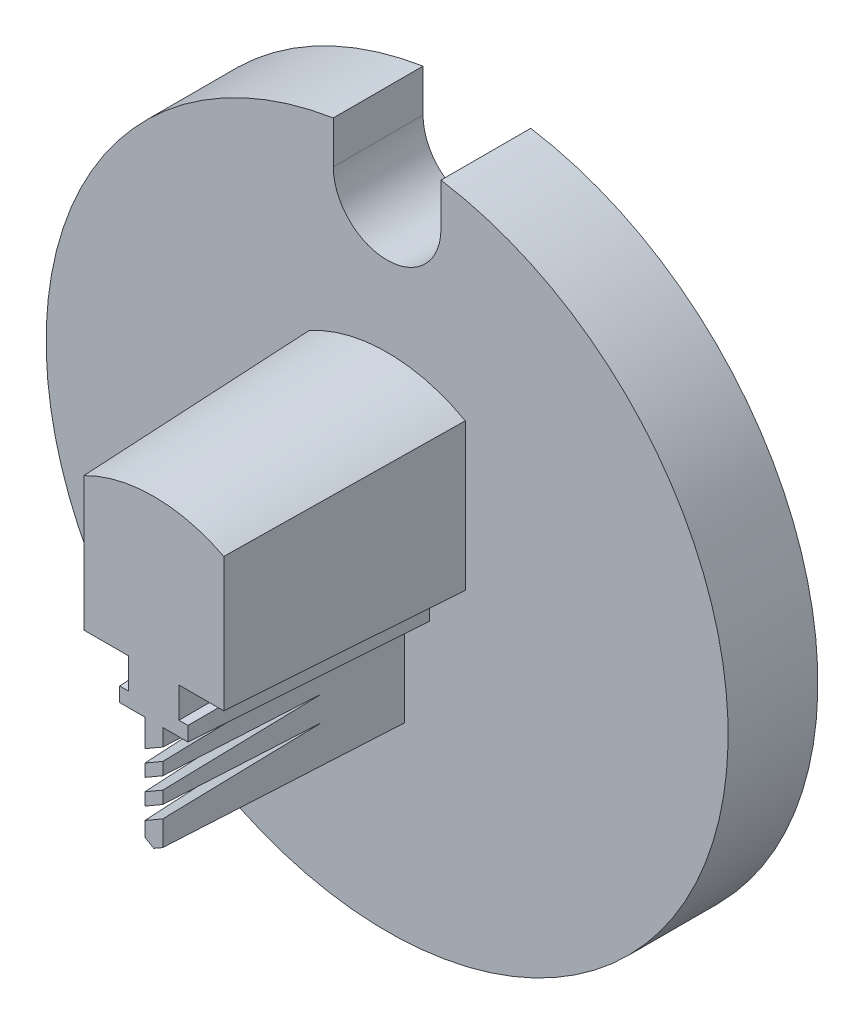
ISO-10303-21;
HEADER;
FILE_DESCRIPTION(('STEP AP214'),'2;1');
FILE_NAME('part.step','',(''),(''),'','','');
FILE_SCHEMA(('AUTOMOTIVE_DESIGN { 1 0 10303 214 1 1 1 1 }'));
ENDSEC;
DATA;
#1=APPLICATION_CONTEXT('core data for automotive mechanical design processes');
#2=APPLICATION_PROTOCOL_DEFINITION('international standard','automotive_design',2000,#1);
#3=PRODUCT_CONTEXT('',#1,'mechanical');
#4=PRODUCT('Part','Part','',(#3));
#5=PRODUCT_RELATED_PRODUCT_CATEGORY('part','',(#4));
#6=PRODUCT_DEFINITION_FORMATION('','',#4);
#7=PRODUCT_DEFINITION_CONTEXT('part definition',#1,'design');
#8=PRODUCT_DEFINITION('design','',#6,#7);
#9=PRODUCT_DEFINITION_SHAPE('','',#8);
#10=(LENGTH_UNIT() NAMED_UNIT(*) SI_UNIT(.MILLI.,.METRE.));
#11=(NAMED_UNIT(*) PLANE_ANGLE_UNIT() SI_UNIT($,.RADIAN.));
#12=(NAMED_UNIT(*) SI_UNIT($,.STERADIAN.) SOLID_ANGLE_UNIT());
#13=UNCERTAINTY_MEASURE_WITH_UNIT(LENGTH_MEASURE(1.E-05),#10,'distance_accuracy_value','');
#14=(GEOMETRIC_REPRESENTATION_CONTEXT(3) GLOBAL_UNCERTAINTY_ASSIGNED_CONTEXT((#13)) GLOBAL_UNIT_ASSIGNED_CONTEXT((#10,
#11,#12)) REPRESENTATION_CONTEXT('',''));
#15=CARTESIAN_POINT('',(0.,0.,0.));
#16=DIRECTION('',(0.,0.,1.));
#17=DIRECTION('',(1.,0.,0.));
#18=AXIS2_PLACEMENT_3D('',#15,#16,#17);
#19=CARTESIAN_POINT('',(0.,-0.800000052899123,9.));
#20=DIRECTION('',(0.,0.999390827019096,0.0348994967025009));
#21=DIRECTION('',(0.,-0.0348994967025009,0.999390827019096));
#22=AXIS2_PLACEMENT_3D('',#19,#20,#21);
#23=PLANE('',#22);
#24=DIRECTION('',(0.0348782627423745,-0.0348782627423746,0.998782765958718));
#25=VECTOR('',#24,1.);
#26=CARTESIAN_POINT('',(-0.926984948797238,-0.573015051202763,2.5));
#27=LINE('',#26,#25);
#28=CARTESIAN_POINT('',(-0.926984948797238,-0.573015051202763,2.5));
#29=VERTEX_POINT('',#28);
#30=CARTESIAN_POINT('',(-0.699999947100878,-0.800000052899123,9.));
#31=VERTEX_POINT('',#30);
#32=EDGE_CURVE('E132',#29,#31,#27,.T.);
#33=ORIENTED_EDGE('',*,*,#32,.F.);
#34=DIRECTION('',(1.,0.,0.));
#35=VECTOR('',#34,1.);
#36=CARTESIAN_POINT('',(0.,-0.573015051202763,2.5));
#37=LINE('',#36,#35);
#38=CARTESIAN_POINT('',(-1.17698494879724,-0.573015051202763,2.5));
#39=VERTEX_POINT('',#38);
#40=EDGE_CURVE('E138',#29,#39,#37,.F.);
#41=ORIENTED_EDGE('',*,*,#40,.T.);
#42=DIRECTION('',(-0.0348782627423745,0.0348782627423746,-0.998782765958718));
#43=VECTOR('',#42,1.);
#44=CARTESIAN_POINT('',(-0.949999947100878,-0.800000052899123,9.));
#45=LINE('',#44,#43);
#46=CARTESIAN_POINT('',(-0.949999947100878,-0.800000052899123,9.));
#47=VERTEX_POINT('',#46);
#48=EDGE_CURVE('E134',#47,#39,#45,.T.);
#49=ORIENTED_EDGE('',*,*,#48,.F.);
#50=DIRECTION('',(1.,0.,0.));
#51=VECTOR('',#50,1.);
#52=CARTESIAN_POINT('',(0.,-0.800000052899123,9.));
#53=LINE('',#52,#51);
#54=EDGE_CURVE('E130',#47,#31,#53,.T.);
#55=ORIENTED_EDGE('',*,*,#54,.T.);
#56=EDGE_LOOP('',(#33,#41,#49,#55));
#57=FACE_BOUND('',#56,.T.);
#58=ADVANCED_FACE('F17',(#57),#23,.T.);
#59=CARTESIAN_POINT('',(0.,-0.800000052899123,9.));
#60=DIRECTION('',(0.,0.999390827019096,0.0348994967025009));
#61=DIRECTION('',(0.,-0.0348994967025009,0.999390827019096));
#62=AXIS2_PLACEMENT_3D('',#59,#60,#61);
#63=PLANE('',#62);
#64=DIRECTION('',(1.,0.,0.));
#65=VECTOR('',#64,1.);
#66=CARTESIAN_POINT('',(0.,-0.573015051202763,2.5));
#67=LINE('',#66,#65);
#68=CARTESIAN_POINT('',(1.17698494879724,-0.573015051202763,2.5));
#69=VERTEX_POINT('',#68);
#70=CARTESIAN_POINT('',(0.926984948797238,-0.573015051202763,2.5));
#71=VERTEX_POINT('',#70);
#72=EDGE_CURVE('E168',#69,#71,#67,.F.);
#73=ORIENTED_EDGE('',*,*,#72,.T.);
#74=DIRECTION('',(0.0348782627423745,0.0348782627423746,-0.998782765958718));
#75=VECTOR('',#74,1.);
#76=CARTESIAN_POINT('',(0.699999947100878,-0.800000052899123,9.));
#77=LINE('',#76,#75);
#78=CARTESIAN_POINT('',(0.699999947100878,-0.800000052899123,9.));
#79=VERTEX_POINT('',#78);
#80=EDGE_CURVE('E148',#79,#71,#77,.T.);
#81=ORIENTED_EDGE('',*,*,#80,.F.);
#82=DIRECTION('',(1.,0.,0.));
#83=VECTOR('',#82,1.);
#84=CARTESIAN_POINT('',(0.,-0.800000052899123,9.));
#85=LINE('',#84,#83);
#86=CARTESIAN_POINT('',(0.949999947100878,-0.800000052899123,9.));
#87=VERTEX_POINT('',#86);
#88=EDGE_CURVE('E166',#79,#87,#85,.T.);
#89=ORIENTED_EDGE('',*,*,#88,.T.);
#90=DIRECTION('',(-0.0348782627423745,-0.0348782627423746,0.998782765958718));
#91=VECTOR('',#90,1.);
#92=CARTESIAN_POINT('',(1.17698494879724,-0.573015051202763,2.5));
#93=LINE('',#92,#91);
#94=EDGE_CURVE('E184',#69,#87,#93,.T.);
#95=ORIENTED_EDGE('',*,*,#94,.F.);
#96=EDGE_LOOP('',(#73,#81,#89,#95));
#97=FACE_BOUND('',#96,.T.);
#98=ADVANCED_FACE('F330',(#97),#63,.T.);
#99=CARTESIAN_POINT('',(-0.949999947100878,-0.059584240176571,9.));
#100=DIRECTION('',(-0.999390827019096,0.,0.0348994967025009));
#101=DIRECTION('',(0.0348994967025009,0.,0.999390827019096));
#102=AXIS2_PLACEMENT_3D('',#99,#100,#101);
#103=PLANE('',#102);
#104=ORIENTED_EDGE('',*,*,#48,.T.);
#105=DIRECTION('',(0.,1.,0.));
#106=VECTOR('',#105,1.);
#107=CARTESIAN_POINT('',(-1.17698494879724,-0.059584240176571,2.5));
#108=LINE('',#107,#106);
#109=CARTESIAN_POINT('',(-1.17698494879724,-1.42698494879724,2.5));
#110=VERTEX_POINT('',#109);
#111=EDGE_CURVE('E153',#39,#110,#108,.F.);
#112=ORIENTED_EDGE('',*,*,#111,.T.);
#113=DIRECTION('',(-0.0348782627423749,-0.0348782627423745,-0.998782765958718));
#114=VECTOR('',#113,1.);
#115=CARTESIAN_POINT('',(-0.949999947100878,-1.19999994710088,9.));
#116=LINE('',#115,#114);
#117=CARTESIAN_POINT('',(-0.949999947100878,-1.19999994710088,9.));
#118=VERTEX_POINT('',#117);
#119=EDGE_CURVE('E190',#118,#110,#116,.T.);
#120=ORIENTED_EDGE('',*,*,#119,.F.);
#121=DIRECTION('',(0.,1.,0.));
#122=VECTOR('',#121,1.);
#123=CARTESIAN_POINT('',(-0.949999947100878,-0.059584240176571,9.));
#124=LINE('',#123,#122);
#125=EDGE_CURVE('E172',#118,#47,#124,.T.);
#126=ORIENTED_EDGE('',*,*,#125,.T.);
#127=EDGE_LOOP('',(#104,#112,#120,#126));
#128=FACE_BOUND('',#127,.T.);
#129=ADVANCED_FACE('F328',(#128),#103,.T.);
#130=CARTESIAN_POINT('',(-0.699999947100878,-0.059584240176571,9.));
#131=DIRECTION('',(-0.999390827019096,0.,0.0348994967025009));
#132=DIRECTION('',(0.0348994967025009,0.,0.999390827019096));
#133=AXIS2_PLACEMENT_3D('',#130,#131,#132);
#134=PLANE('',#133);
#135=DIRECTION('',(0.,1.,0.));
#136=VECTOR('',#135,1.);
#137=CARTESIAN_POINT('',(-0.926984948797238,-0.059584240176571,2.5));
#138=LINE('',#137,#136);
#139=CARTESIAN_POINT('',(-0.926984948797238,-0.176984948797237,2.5));
#140=VERTEX_POINT('',#139);
#141=EDGE_CURVE('E146',#140,#29,#138,.F.);
#142=ORIENTED_EDGE('',*,*,#141,.T.);
#143=ORIENTED_EDGE('',*,*,#32,.T.);
#144=DIRECTION('',(0.,1.,0.));
#145=VECTOR('',#144,1.);
#146=CARTESIAN_POINT('',(-0.699999947100878,-0.059584240176571,9.));
#147=LINE('',#146,#145);
#148=CARTESIAN_POINT('',(-0.699999947100878,0.0500000528991231,9.));
#149=VERTEX_POINT('',#148);
#150=EDGE_CURVE('E143',#31,#149,#147,.T.);
#151=ORIENTED_EDGE('',*,*,#150,.T.);
#152=DIRECTION('',(0.0348782627423746,0.0348782627423746,0.998782765958718));
#153=VECTOR('',#152,1.);
#154=CARTESIAN_POINT('',(-0.926984948797238,-0.176984948797237,2.5));
#155=LINE('',#154,#153);
#156=EDGE_CURVE('E531',#140,#149,#155,.T.);
#157=ORIENTED_EDGE('',*,*,#156,.F.);
#158=EDGE_LOOP('',(#142,#143,#151,#157));
#159=FACE_BOUND('',#158,.T.);
#160=ADVANCED_FACE('F141',(#159),#134,.T.);
#161=CARTESIAN_POINT('',(0.699999947100878,-0.059584240176571,9.));
#162=DIRECTION('',(0.999390827019096,0.,0.0348994967025009));
#163=DIRECTION('',(0.0348994967025009,0.,-0.999390827019096));
#164=AXIS2_PLACEMENT_3D('',#161,#162,#163);
#165=PLANE('',#164);
#166=ORIENTED_EDGE('',*,*,#80,.T.);
#167=DIRECTION('',(0.,1.,0.));
#168=VECTOR('',#167,1.);
#169=CARTESIAN_POINT('',(0.926984948797238,-0.059584240176571,2.5));
#170=LINE('',#169,#168);
#171=CARTESIAN_POINT('',(0.926984948797238,-0.176984948797237,2.5));
#172=VERTEX_POINT('',#171);
#173=EDGE_CURVE('E185',#71,#172,#170,.T.);
#174=ORIENTED_EDGE('',*,*,#173,.T.);
#175=DIRECTION('',(0.0348782627423746,-0.0348782627423746,-0.998782765958718));
#176=VECTOR('',#175,1.);
#177=CARTESIAN_POINT('',(0.699999947100878,0.0500000528991231,9.));
#178=LINE('',#177,#176);
#179=CARTESIAN_POINT('',(0.699999947100878,0.0500000528991231,9.));
#180=VERTEX_POINT('',#179);
#181=EDGE_CURVE('E515',#180,#172,#178,.T.);
#182=ORIENTED_EDGE('',*,*,#181,.F.);
#183=DIRECTION('',(0.,1.,0.));
#184=VECTOR('',#183,1.);
#185=CARTESIAN_POINT('',(0.699999947100878,-0.059584240176571,9.));
#186=LINE('',#185,#184);
#187=EDGE_CURVE('E196',#79,#180,#186,.T.);
#188=ORIENTED_EDGE('',*,*,#187,.F.);
#189=EDGE_LOOP('',(#166,#174,#182,#188));
#190=FACE_BOUND('',#189,.T.);
#191=ADVANCED_FACE('F321',(#190),#165,.T.);
#192=CARTESIAN_POINT('',(0.949999947100878,-0.059584240176571,9.));
#193=DIRECTION('',(0.999390827019096,0.,0.0348994967025009));
#194=DIRECTION('',(0.0348994967025009,0.,-0.999390827019096));
#195=AXIS2_PLACEMENT_3D('',#192,#193,#194);
#196=PLANE('',#195);
#197=DIRECTION('',(0.,1.,0.));
#198=VECTOR('',#197,1.);
#199=CARTESIAN_POINT('',(1.17698494879724,-0.059584240176571,2.5));
#200=LINE('',#199,#198);
#201=CARTESIAN_POINT('',(1.17698494879724,-1.42698494879724,2.5));
#202=VERTEX_POINT('',#201);
#203=EDGE_CURVE('E182',#202,#69,#200,.T.);
#204=ORIENTED_EDGE('',*,*,#203,.T.);
#205=ORIENTED_EDGE('',*,*,#94,.T.);
#206=DIRECTION('',(0.,1.,0.));
#207=VECTOR('',#206,1.);
#208=CARTESIAN_POINT('',(0.949999947100878,-0.059584240176571,9.));
#209=LINE('',#208,#207);
#210=CARTESIAN_POINT('',(0.949999947100878,-1.19999994710088,9.));
#211=VERTEX_POINT('',#210);
#212=EDGE_CURVE('E193',#211,#87,#209,.T.);
#213=ORIENTED_EDGE('',*,*,#212,.F.);
#214=DIRECTION('',(-0.0348782627423749,0.0348782627423745,0.998782765958718));
#215=VECTOR('',#214,1.);
#216=CARTESIAN_POINT('',(1.17698494879724,-1.42698494879724,2.5));
#217=LINE('',#216,#215);
#218=EDGE_CURVE('E467',#202,#211,#217,.T.);
#219=ORIENTED_EDGE('',*,*,#218,.F.);
#220=EDGE_LOOP('',(#204,#205,#213,#219));
#221=FACE_BOUND('',#220,.T.);
#222=ADVANCED_FACE('F317',(#221),#196,.T.);
#223=CARTESIAN_POINT('',(0.,-1.19999994710088,9.));
#224=DIRECTION('',(0.,-0.999390827019096,0.0348994967025009));
#225=DIRECTION('',(0.,-0.0348994967025009,-0.999390827019096));
#226=AXIS2_PLACEMENT_3D('',#223,#224,#225);
#227=PLANE('',#226);
#228=DIRECTION('',(1.,0.,0.));
#229=VECTOR('',#228,1.);
#230=CARTESIAN_POINT('',(0.,-1.42698494879724,2.5));
#231=LINE('',#230,#229);
#232=CARTESIAN_POINT('',(-0.476984962022018,-1.42698494879724,2.5));
#233=VERTEX_POINT('',#232);
#234=EDGE_CURVE('E541',#110,#233,#231,.T.);
#235=ORIENTED_EDGE('',*,*,#234,.T.);
#236=DIRECTION('',(-0.0348782627423745,-0.0348782627423746,-0.998782765958718));
#237=VECTOR('',#236,1.);
#238=CARTESIAN_POINT('',(-0.249999947100877,-1.19999994710088,9.));
#239=LINE('',#238,#237);
#240=CARTESIAN_POINT('',(-0.249999947100877,-1.19999994710088,9.));
#241=VERTEX_POINT('',#240);
#242=EDGE_CURVE('E451',#241,#233,#239,.T.);
#243=ORIENTED_EDGE('',*,*,#242,.F.);
#244=DIRECTION('',(1.,0.,0.));
#245=VECTOR('',#244,1.);
#246=CARTESIAN_POINT('',(0.,-1.19999994710088,9.));
#247=LINE('',#246,#245);
#248=EDGE_CURVE('E524',#118,#241,#247,.T.);
#249=ORIENTED_EDGE('',*,*,#248,.F.);
#250=ORIENTED_EDGE('',*,*,#119,.T.);
#251=EDGE_LOOP('',(#235,#243,#249,#250));
#252=FACE_BOUND('',#251,.T.);
#253=ADVANCED_FACE('F313',(#252),#227,.T.);
#254=CARTESIAN_POINT('',(-1.81115388530749,-3.19659478985493,9.));
#255=DIRECTION('',(-0.499695413509547,-0.865497844507677,0.0348994967025009));
#256=DIRECTION('',(0.866025403784439,-0.499999999999999,0.));
#257=AXIS2_PLACEMENT_3D('',#254,#255,#256);
#258=PLANE('',#257);
#259=DIRECTION('',(0.866025403784439,-0.499999999999999,0.));
#260=VECTOR('',#259,1.);
#261=CARTESIAN_POINT('',(-1.92464638615567,-3.39316956760203,2.5));
#262=LINE('',#261,#260);
#263=CARTESIAN_POINT('',(-0.476984988471582,-4.22897725760573,2.5));
#264=VERTEX_POINT('',#263);
#265=CARTESIAN_POINT('',(0.,-4.50436467674384,2.5));
#266=VERTEX_POINT('',#265);
#267=EDGE_CURVE('E536',#264,#266,#262,.T.);
#268=ORIENTED_EDGE('',*,*,#267,.T.);
#269=DIRECTION('',(0.,-0.0402902897014402,-0.999188016619382));
#270=VECTOR('',#269,1.);
#271=CARTESIAN_POINT('',(0.,-4.24226497308104,9.));
#272=LINE('',#271,#270);
#273=CARTESIAN_POINT('',(0.,-4.24226497308104,9.));
#274=VERTEX_POINT('',#273);
#275=EDGE_CURVE('E473',#274,#266,#272,.T.);
#276=ORIENTED_EDGE('',*,*,#275,.F.);
#277=DIRECTION('',(0.866025403784434,-0.500000000000009,0.));
#278=VECTOR('',#277,1.);
#279=CARTESIAN_POINT('',(-0.25,-4.09792740578363,9.));
#280=LINE('',#279,#278);
#281=CARTESIAN_POINT('',(-0.249999986791328,-4.09792740578363,8.99999999953874));
#282=VERTEX_POINT('',#281);
#283=EDGE_CURVE('E479',#282,#274,#280,.T.);
#284=ORIENTED_EDGE('',*,*,#283,.F.);
#285=DIRECTION('',(0.034892414407282,0.0201451448507201,0.999188016619382));
#286=VECTOR('',#285,1.);
#287=CARTESIAN_POINT('',(-0.476984948861666,-4.22897725761503,2.49999999815497));
#288=LINE('',#287,#286);
#289=EDGE_CURVE('E448',#264,#282,#288,.T.);
#290=ORIENTED_EDGE('',*,*,#289,.F.);
#291=EDGE_LOOP('',(#268,#276,#284,#290));
#292=FACE_BOUND('',#291,.T.);
#293=ADVANCED_FACE('F309',(#292),#258,.T.);
#294=CARTESIAN_POINT('',(0.,0.0500000528991232,9.));
#295=DIRECTION('',(0.,-0.999390827019096,0.0348994967025009));
#296=DIRECTION('',(0.,-0.0348994967025009,-0.999390827019096));
#297=AXIS2_PLACEMENT_3D('',#294,#295,#296);
#298=PLANE('',#297);
#299=DIRECTION('',(1.,0.,0.));
#300=VECTOR('',#299,1.);
#301=CARTESIAN_POINT('',(0.,-0.176984948797237,2.5));
#302=LINE('',#301,#300);
#303=CARTESIAN_POINT('',(-2.17698494879724,-0.176984948797237,2.5));
#304=VERTEX_POINT('',#303);
#305=EDGE_CURVE('E534',#304,#140,#302,.T.);
#306=ORIENTED_EDGE('',*,*,#305,.T.);
#307=ORIENTED_EDGE('',*,*,#156,.T.);
#308=DIRECTION('',(1.,0.,0.));
#309=VECTOR('',#308,1.);
#310=CARTESIAN_POINT('',(0.,0.050000052899123,9.));
#311=LINE('',#310,#309);
#312=CARTESIAN_POINT('',(-1.94999994710088,0.050000052899123,9.));
#313=VERTEX_POINT('',#312);
#314=EDGE_CURVE('E152',#313,#149,#311,.T.);
#315=ORIENTED_EDGE('',*,*,#314,.F.);
#316=DIRECTION('',(0.0348782627423745,0.0348782627423747,0.998782765958718));
#317=VECTOR('',#316,1.);
#318=CARTESIAN_POINT('',(-2.17698494879724,-0.176984948797238,2.5));
#319=LINE('',#318,#317);
#320=EDGE_CURVE('E83',#304,#313,#319,.T.);
#321=ORIENTED_EDGE('',*,*,#320,.F.);
#322=EDGE_LOOP('',(#306,#307,#315,#321));
#323=FACE_BOUND('',#322,.T.);
#324=ADVANCED_FACE('F306',(#323),#298,.T.);
#325=CARTESIAN_POINT('',(0.,-0.059584240176571,9.));
#326=DIRECTION('',(0.,0.,1.));
#327=DIRECTION('',(1.,0.,0.));
#328=AXIS2_PLACEMENT_3D('',#325,#326,#327);
#329=PLANE('',#328);
#330=ORIENTED_EDGE('',*,*,#88,.F.);
#331=ORIENTED_EDGE('',*,*,#187,.T.);
#332=DIRECTION('',(1.,0.,0.));
#333=VECTOR('',#332,1.);
#334=CARTESIAN_POINT('',(0.,0.0500000528991232,9.));
#335=LINE('',#334,#333);
#336=CARTESIAN_POINT('',(1.94999994710088,0.050000052899123,9.));
#337=VERTEX_POINT('',#336);
#338=EDGE_CURVE('E518',#337,#180,#335,.F.);
#339=ORIENTED_EDGE('',*,*,#338,.F.);
#340=DIRECTION('',(0.,1.,0.));
#341=VECTOR('',#340,1.);
#342=CARTESIAN_POINT('',(1.94999994710088,-0.0595842401765712,9.));
#343=LINE('',#342,#341);
#344=CARTESIAN_POINT('',(1.94999994710083,3.77624154501181,9.0000000000087));
#345=VERTEX_POINT('',#344);
#346=EDGE_CURVE('E421',#345,#337,#343,.F.);
#347=ORIENTED_EDGE('',*,*,#346,.F.);
#348=CARTESIAN_POINT('',(0.,0.,9.00000000001455));
#349=DIRECTION('',(0.,0.,-1.));
#350=DIRECTION('',(-1.,0.,0.));
#351=AXIS2_PLACEMENT_3D('',#348,#349,#350);
#352=CIRCLE('',#351,4.24999999999584);
#353=CARTESIAN_POINT('',(-1.94999994710088,3.77624154501184,9.00000000000728));
#354=VERTEX_POINT('',#353);
#355=EDGE_CURVE('E20',#354,#345,#352,.T.);
#356=ORIENTED_EDGE('',*,*,#355,.F.);
#357=DIRECTION('',(0.,1.,0.));
#358=VECTOR('',#357,1.);
#359=CARTESIAN_POINT('',(-1.94999994710088,-0.0595842401765712,9.));
#360=LINE('',#359,#358);
#361=EDGE_CURVE('E75',#313,#354,#360,.T.);
#362=ORIENTED_EDGE('',*,*,#361,.F.);
#363=ORIENTED_EDGE('',*,*,#314,.T.);
#364=ORIENTED_EDGE('',*,*,#150,.F.);
#365=ORIENTED_EDGE('',*,*,#54,.F.);
#366=ORIENTED_EDGE('',*,*,#125,.F.);
#367=ORIENTED_EDGE('',*,*,#248,.T.);
#368=DIRECTION('',(0.,1.,0.));
#369=VECTOR('',#368,1.);
#370=CARTESIAN_POINT('',(-0.249999947100877,-0.059584240176571,9.));
#371=LINE('',#370,#369);
#372=CARTESIAN_POINT('',(-0.249999947100877,-1.96173131815805,9.));
#373=VERTEX_POINT('',#372);
#374=EDGE_CURVE('E454',#373,#241,#371,.T.);
#375=ORIENTED_EDGE('',*,*,#374,.F.);
#376=DIRECTION('',(0.866025403784439,0.5,0.));
#377=VECTOR('',#376,1.);
#378=CARTESIAN_POINT('',(0.761153858857929,-1.37794139609562,9.));
#379=LINE('',#378,#377);
#380=CARTESIAN_POINT('',(0.249999947100877,-1.67305624464588,9.));
#381=VERTEX_POINT('',#380);
#382=EDGE_CURVE('E505',#381,#373,#379,.F.);
#383=ORIENTED_EDGE('',*,*,#382,.F.);
#384=DIRECTION('',(0.,1.,0.));
#385=VECTOR('',#384,1.);
#386=CARTESIAN_POINT('',(0.249999947100877,-0.059584240176571,9.));
#387=LINE('',#386,#385);
#388=CARTESIAN_POINT('',(0.249999947100877,-1.19999994710088,9.));
#389=VERTEX_POINT('',#388);
#390=EDGE_CURVE('E197',#381,#389,#387,.T.);
#391=ORIENTED_EDGE('',*,*,#390,.T.);
#392=DIRECTION('',(1.,0.,0.));
#393=VECTOR('',#392,1.);
#394=CARTESIAN_POINT('',(0.,-1.19999994710088,9.));
#395=LINE('',#394,#393);
#396=EDGE_CURVE('E465',#211,#389,#395,.F.);
#397=ORIENTED_EDGE('',*,*,#396,.F.);
#398=ORIENTED_EDGE('',*,*,#212,.T.);
#399=EDGE_LOOP('',(#330,#331,#339,#347,#356,#362,#363,#364,#365,#366,#367,#375,#383,#391,#397,#398));
#400=FACE_BOUND('',#399,.T.);
#401=ADVANCED_FACE('F151',(#400),#329,.T.);
#402=CARTESIAN_POINT('',(0.,0.0500000528991232,9.));
#403=DIRECTION('',(0.,-0.999390827019096,0.0348994967025009));
#404=DIRECTION('',(0.,-0.0348994967025009,-0.999390827019096));
#405=AXIS2_PLACEMENT_3D('',#402,#403,#404);
#406=PLANE('',#405);
#407=ORIENTED_EDGE('',*,*,#181,.T.);
#408=DIRECTION('',(1.,0.,0.));
#409=VECTOR('',#408,1.);
#410=CARTESIAN_POINT('',(0.,-0.176984948797237,2.5));
#411=LINE('',#410,#409);
#412=CARTESIAN_POINT('',(2.17698494879724,-0.176984948797238,2.5));
#413=VERTEX_POINT('',#412);
#414=EDGE_CURVE('E508',#172,#413,#411,.T.);
#415=ORIENTED_EDGE('',*,*,#414,.T.);
#416=DIRECTION('',(0.0348782627423745,-0.0348782627423747,-0.998782765958718));
#417=VECTOR('',#416,1.);
#418=CARTESIAN_POINT('',(1.94999994710088,0.050000052899123,9.));
#419=LINE('',#418,#417);
#420=EDGE_CURVE('E233',#337,#413,#419,.T.);
#421=ORIENTED_EDGE('',*,*,#420,.F.);
#422=ORIENTED_EDGE('',*,*,#338,.T.);
#423=EDGE_LOOP('',(#407,#415,#421,#422));
#424=FACE_BOUND('',#423,.T.);
#425=ADVANCED_FACE('F299',(#424),#406,.T.);
#426=CARTESIAN_POINT('',(0.761153858857929,-1.37794139609562,9.));
#427=DIRECTION('',(0.499695413509548,-0.865497844507677,0.0348994967025009));
#428=DIRECTION('',(0.866025403784439,0.5,0.));
#429=AXIS2_PLACEMENT_3D('',#426,#427,#428);
#430=PLANE('',#429);
#431=DIRECTION('',(0.034892414407282,-0.0201451448507193,-0.999188016619382));
#432=VECTOR('',#431,1.);
#433=CARTESIAN_POINT('',(0.249999947100877,-1.67305624464588,9.));
#434=LINE('',#433,#432);
#435=CARTESIAN_POINT('',(0.399999973625384,-1.75965880032587,4.70456124769397));
#436=VERTEX_POINT('',#435);
#437=EDGE_CURVE('E232',#381,#436,#434,.T.);
#438=ORIENTED_EDGE('',*,*,#437,.F.);
#439=ORIENTED_EDGE('',*,*,#382,.T.);
#440=DIRECTION('',(0.0348359108380612,0.0603375674994606,0.997569966099787));
#441=VECTOR('',#440,1.);
#442=CARTESIAN_POINT('',(-0.399999973678828,-2.22153898532774,4.70456124646971));
#443=LINE('',#442,#441);
#444=CARTESIAN_POINT('',(-0.399999973700322,-2.2215389852413,4.70456124769476));
#445=VERTEX_POINT('',#444);
#446=EDGE_CURVE('E457',#445,#373,#443,.T.);
#447=ORIENTED_EDGE('',*,*,#446,.F.);
#448=DIRECTION('',(-0.866025403784439,-0.5,0.));
#449=VECTOR('',#448,1.);
#450=CARTESIAN_POINT('',(0.836153872061295,-1.50784522953218,4.70456124891979));
#451=LINE('',#450,#449);
#452=EDGE_CURVE('E502',#436,#445,#451,.T.);
#453=ORIENTED_EDGE('',*,*,#452,.F.);
#454=EDGE_LOOP('',(#438,#439,#447,#453));
#455=FACE_BOUND('',#454,.T.);
#456=ADVANCED_FACE('F295',(#455),#430,.T.);
#457=CARTESIAN_POINT('',(0.911153885307491,-1.63774906304293,9.));
#458=DIRECTION('',(-0.499695413509548,0.865497844507677,0.0348994967025009));
#459=DIRECTION('',(-0.866025403784439,-0.5,0.));
#460=AXIS2_PLACEMENT_3D('',#457,#458,#459);
#461=PLANE('',#460);
#462=DIRECTION('',(-0.866025403784441,-0.499999999999996,0.));
#463=VECTOR('',#462,1.);
#464=CARTESIAN_POINT('',(0.25,-2.01946643670098,9.));
#465=LINE('',#464,#463);
#466=CARTESIAN_POINT('',(0.249999986791326,-2.01946643670098,8.99999999953874));
#467=VERTEX_POINT('',#466);
#468=CARTESIAN_POINT('',(-0.249999986791327,-2.30814157129579,8.99999999953874));
#469=VERTEX_POINT('',#468);
#470=EDGE_CURVE('E499',#467,#469,#465,.T.);
#471=ORIENTED_EDGE('',*,*,#470,.F.);
#472=DIRECTION('',(-0.0348359108529638,-0.0603375604352665,0.997569966526541));
#473=VECTOR('',#472,1.);
#474=CARTESIAN_POINT('',(0.399999973593374,-1.75965880031977,4.7045612489168));
#475=LINE('',#474,#473);
#476=EDGE_CURVE('E415',#436,#467,#475,.T.);
#477=ORIENTED_EDGE('',*,*,#476,.F.);
#478=ORIENTED_EDGE('',*,*,#452,.T.);
#479=DIRECTION('',(-0.0348924144023306,0.020145151891945,-0.999188016477593));
#480=VECTOR('',#479,1.);
#481=CARTESIAN_POINT('',(-0.249999947165307,-2.30814157129579,8.99999999815497));
#482=LINE('',#481,#480);
#483=EDGE_CURVE('E460',#469,#445,#482,.T.);
#484=ORIENTED_EDGE('',*,*,#483,.F.);
#485=EDGE_LOOP('',(#471,#477,#478,#484));
#486=FACE_BOUND('',#485,.T.);
#487=ADVANCED_FACE('F291',(#486),#461,.T.);
#488=CARTESIAN_POINT('',(0.,-0.059584240176571,9.));
#489=DIRECTION('',(0.,0.,1.));
#490=DIRECTION('',(1.,0.,0.));
#491=AXIS2_PLACEMENT_3D('',#488,#489,#490);
#492=PLANE('',#491);
#493=DIRECTION('',(0.,1.,0.));
#494=VECTOR('',#493,1.);
#495=CARTESIAN_POINT('',(-0.249999947165307,-0.059584240176571,8.99999999815497));
#496=LINE('',#495,#494);
#497=CARTESIAN_POINT('',(-0.249999986791326,-2.65455173280956,8.99999999953874));
#498=VERTEX_POINT('',#497);
#499=EDGE_CURVE('E425',#498,#469,#496,.T.);
#500=ORIENTED_EDGE('',*,*,#499,.F.);
#501=DIRECTION('',(0.866025403784439,0.5,0.));
#502=VECTOR('',#501,1.);
#503=CARTESIAN_POINT('',(1.06115388530749,-1.89755668417826,9.));
#504=LINE('',#503,#502);
#505=CARTESIAN_POINT('',(0.249999986791327,-2.36587659821475,8.99999999953874));
#506=VERTEX_POINT('',#505);
#507=EDGE_CURVE('E497',#506,#498,#504,.F.);
#508=ORIENTED_EDGE('',*,*,#507,.F.);
#509=DIRECTION('',(0.,1.,0.));
#510=VECTOR('',#509,1.);
#511=CARTESIAN_POINT('',(0.249999947165307,-0.059584240176571,8.99999999815497));
#512=LINE('',#511,#510);
#513=EDGE_CURVE('E412',#467,#506,#512,.F.);
#514=ORIENTED_EDGE('',*,*,#513,.F.);
#515=ORIENTED_EDGE('',*,*,#470,.T.);
#516=EDGE_LOOP('',(#500,#508,#514,#515));
#517=FACE_BOUND('',#516,.T.);
#518=ADVANCED_FACE('F287',(#517),#492,.T.);
#519=CARTESIAN_POINT('',(1.06115388530749,-1.89755668417826,9.));
#520=DIRECTION('',(0.499695413509548,-0.865497844507677,0.0348994967025009));
#521=DIRECTION('',(0.866025403784439,0.5,0.));
#522=AXIS2_PLACEMENT_3D('',#519,#520,#521);
#523=PLANE('',#522);
#524=ORIENTED_EDGE('',*,*,#507,.T.);
#525=DIRECTION('',(0.0348359108380612,0.0603375674994633,0.997569966099787));
#526=VECTOR('',#525,1.);
#527=CARTESIAN_POINT('',(-0.399999947165306,-2.9143593539449,4.70456200571763));
#528=LINE('',#527,#526);
#529=CARTESIAN_POINT('',(-0.39999998679133,-2.9143593539449,4.70456200710137));
#530=VERTEX_POINT('',#529);
#531=EDGE_CURVE('E430',#530,#498,#528,.T.);
#532=ORIENTED_EDGE('',*,*,#531,.F.);
#533=DIRECTION('',(-0.866025403784439,-0.5,0.));
#534=VECTOR('',#533,1.);
#535=CARTESIAN_POINT('',(1.13615388530749,-2.02746049474592,4.70456200756265));
#536=LINE('',#535,#534);
#537=CARTESIAN_POINT('',(0.399999986791324,-2.4524791385932,4.7045620071014));
#538=VERTEX_POINT('',#537);
#539=EDGE_CURVE('E494',#538,#530,#536,.T.);
#540=ORIENTED_EDGE('',*,*,#539,.F.);
#541=DIRECTION('',(0.0348924144072819,-0.0201451448507216,-0.999188016619382));
#542=VECTOR('',#541,1.);
#543=CARTESIAN_POINT('',(0.249999947165307,-2.36587659821475,8.99999999815497));
#544=LINE('',#543,#542);
#545=EDGE_CURVE('E409',#506,#538,#544,.T.);
#546=ORIENTED_EDGE('',*,*,#545,.F.);
#547=EDGE_LOOP('',(#524,#532,#540,#546));
#548=FACE_BOUND('',#547,.T.);
#549=ADVANCED_FACE('F283',(#548),#523,.T.);
#550=CARTESIAN_POINT('',(1.21115388530749,-2.15736430531359,9.));
#551=DIRECTION('',(-0.499695413509548,0.865497844507677,0.0348994967025009));
#552=DIRECTION('',(-0.866025403784439,-0.5,0.));
#553=AXIS2_PLACEMENT_3D('',#550,#551,#552);
#554=PLANE('',#553);
#555=DIRECTION('',(-0.0348924144072819,0.0201451448507194,-0.999188016619382));
#556=VECTOR('',#555,1.);
#557=CARTESIAN_POINT('',(-0.249999947165307,-3.00096189432334,8.99999999815497));
#558=LINE('',#557,#556);
#559=CARTESIAN_POINT('',(-0.249999986791327,-3.00096189432334,8.99999999953874));
#560=VERTEX_POINT('',#559);
#561=EDGE_CURVE('E433',#560,#530,#558,.T.);
#562=ORIENTED_EDGE('',*,*,#561,.F.);
#563=DIRECTION('',(-0.866025403784441,-0.499999999999996,0.));
#564=VECTOR('',#563,1.);
#565=CARTESIAN_POINT('',(0.25,-2.71228675972853,9.));
#566=LINE('',#565,#564);
#567=CARTESIAN_POINT('',(0.249999986791325,-2.71228675972853,8.99999999953874));
#568=VERTEX_POINT('',#567);
#569=EDGE_CURVE('E491',#568,#560,#566,.T.);
#570=ORIENTED_EDGE('',*,*,#569,.F.);
#571=DIRECTION('',(-0.0348359108380612,-0.0603375674994609,0.997569966099787));
#572=VECTOR('',#571,1.);
#573=CARTESIAN_POINT('',(0.399999947165307,-2.4524791385932,4.70456200571762));
#574=LINE('',#573,#572);
#575=EDGE_CURVE('E406',#538,#568,#574,.T.);
#576=ORIENTED_EDGE('',*,*,#575,.F.);
#577=ORIENTED_EDGE('',*,*,#539,.T.);
#578=EDGE_LOOP('',(#562,#570,#576,#577));
#579=FACE_BOUND('',#578,.T.);
#580=ADVANCED_FACE('F279',(#579),#554,.T.);
#581=CARTESIAN_POINT('',(0.,-0.059584240176571,9.));
#582=DIRECTION('',(0.,0.,1.));
#583=DIRECTION('',(1.,0.,0.));
#584=AXIS2_PLACEMENT_3D('',#581,#582,#583);
#585=PLANE('',#584);
#586=ORIENTED_EDGE('',*,*,#569,.T.);
#587=DIRECTION('',(0.,1.,0.));
#588=VECTOR('',#587,1.);
#589=CARTESIAN_POINT('',(-0.249999947165307,-0.059584240176571,8.99999999815497));
#590=LINE('',#589,#588);
#591=CARTESIAN_POINT('',(-0.249999986791327,-3.34737205583712,8.99999999953874));
#592=VERTEX_POINT('',#591);
#593=EDGE_CURVE('E436',#592,#560,#590,.T.);
#594=ORIENTED_EDGE('',*,*,#593,.F.);
#595=DIRECTION('',(0.866025403784439,0.499999999999999,0.));
#596=VECTOR('',#595,1.);
#597=CARTESIAN_POINT('',(1.36115388530749,-2.41717192644893,9.));
#598=LINE('',#597,#596);
#599=CARTESIAN_POINT('',(0.249999986791327,-3.0586969212423,8.99999999953874));
#600=VERTEX_POINT('',#599);
#601=EDGE_CURVE('E488',#600,#592,#598,.F.);
#602=ORIENTED_EDGE('',*,*,#601,.F.);
#603=DIRECTION('',(0.,1.,0.));
#604=VECTOR('',#603,1.);
#605=CARTESIAN_POINT('',(0.249999947165307,-0.059584240176571,8.99999999815497));
#606=LINE('',#605,#604);
#607=EDGE_CURVE('E403',#568,#600,#606,.F.);
#608=ORIENTED_EDGE('',*,*,#607,.F.);
#609=EDGE_LOOP('',(#586,#594,#602,#608));
#610=FACE_BOUND('',#609,.T.);
#611=ADVANCED_FACE('F275',(#610),#585,.T.);
#612=CARTESIAN_POINT('',(1.36115388530749,-2.41717192644893,9.));
#613=DIRECTION('',(0.499695413509547,-0.865497844507677,0.0348994967025009));
#614=DIRECTION('',(0.866025403784439,0.499999999999999,0.));
#615=AXIS2_PLACEMENT_3D('',#612,#613,#614);
#616=PLANE('',#615);
#617=ORIENTED_EDGE('',*,*,#601,.T.);
#618=DIRECTION('',(0.0348359108380612,0.0603375674994611,0.997569966099787));
#619=VECTOR('',#618,1.);
#620=CARTESIAN_POINT('',(-0.399999947165306,-3.60717967697245,4.70456200571763));
#621=LINE('',#620,#619);
#622=CARTESIAN_POINT('',(-0.399999986791326,-3.60717967697245,4.70456200710142));
#623=VERTEX_POINT('',#622);
#624=EDGE_CURVE('E439',#623,#592,#621,.T.);
#625=ORIENTED_EDGE('',*,*,#624,.F.);
#626=DIRECTION('',(-0.866025403784439,-0.5,0.));
#627=VECTOR('',#626,1.);
#628=CARTESIAN_POINT('',(1.43615388530749,-2.54707573701659,4.70456200756266));
#629=LINE('',#628,#627);
#630=CARTESIAN_POINT('',(0.399999986791325,-3.14529946162075,4.70456200710145));
#631=VERTEX_POINT('',#630);
#632=EDGE_CURVE('E485',#631,#623,#629,.T.);
#633=ORIENTED_EDGE('',*,*,#632,.F.);
#634=DIRECTION('',(0.0348924144072819,-0.0201451448507217,-0.999188016619382));
#635=VECTOR('',#634,1.);
#636=CARTESIAN_POINT('',(0.249999947165307,-3.0586969212423,8.99999999815497));
#637=LINE('',#636,#635);
#638=EDGE_CURVE('E400',#600,#631,#637,.T.);
#639=ORIENTED_EDGE('',*,*,#638,.F.);
#640=EDGE_LOOP('',(#617,#625,#633,#639));
#641=FACE_BOUND('',#640,.T.);
#642=ADVANCED_FACE('F271',(#641),#616,.T.);
#643=CARTESIAN_POINT('',(1.51115388530749,-2.67697954758426,9.));
#644=DIRECTION('',(-0.499695413509548,0.865497844507677,0.0348994967025009));
#645=DIRECTION('',(-0.866025403784439,-0.5,0.));
#646=AXIS2_PLACEMENT_3D('',#643,#644,#645);
#647=PLANE('',#646);
#648=DIRECTION('',(-0.0348924144072819,0.0201451448507193,-0.999188016619382));
#649=VECTOR('',#648,1.);
#650=CARTESIAN_POINT('',(-0.249999947165307,-3.69378221735089,8.99999999815497));
#651=LINE('',#650,#649);
#652=CARTESIAN_POINT('',(-0.249999986791326,-3.69378221735089,8.99999999953874));
#653=VERTEX_POINT('',#652);
#654=EDGE_CURVE('E442',#653,#623,#651,.T.);
#655=ORIENTED_EDGE('',*,*,#654,.F.);
#656=DIRECTION('',(-0.866025403784441,-0.499999999999996,0.));
#657=VECTOR('',#656,1.);
#658=CARTESIAN_POINT('',(0.25,-3.40510708275608,9.));
#659=LINE('',#658,#657);
#660=CARTESIAN_POINT('',(0.249999986791327,-3.40510708275608,8.99999999953874));
#661=VERTEX_POINT('',#660);
#662=EDGE_CURVE('E482',#661,#653,#659,.T.);
#663=ORIENTED_EDGE('',*,*,#662,.F.);
#664=DIRECTION('',(-0.0348359108380612,-0.060337567499461,0.997569966099787));
#665=VECTOR('',#664,1.);
#666=CARTESIAN_POINT('',(0.399999947165306,-3.14529946162075,4.70456200571763));
#667=LINE('',#666,#665);
#668=EDGE_CURVE('E397',#631,#661,#667,.T.);
#669=ORIENTED_EDGE('',*,*,#668,.F.);
#670=ORIENTED_EDGE('',*,*,#632,.T.);
#671=EDGE_LOOP('',(#655,#663,#669,#670));
#672=FACE_BOUND('',#671,.T.);
#673=ADVANCED_FACE('F267',(#672),#647,.T.);
#674=CARTESIAN_POINT('',(0.,-0.059584240176571,9.));
#675=DIRECTION('',(0.,0.,1.));
#676=DIRECTION('',(1.,0.,0.));
#677=AXIS2_PLACEMENT_3D('',#674,#675,#676);
#678=PLANE('',#677);
#679=DIRECTION('',(0.,1.,0.));
#680=VECTOR('',#679,1.);
#681=CARTESIAN_POINT('',(-0.249999947165307,-0.059584240176571,8.99999999815497));
#682=LINE('',#681,#680);
#683=EDGE_CURVE('E445',#282,#653,#682,.T.);
#684=ORIENTED_EDGE('',*,*,#683,.F.);
#685=ORIENTED_EDGE('',*,*,#283,.T.);
#686=DIRECTION('',(0.866025403784439,0.5,0.));
#687=VECTOR('',#686,1.);
#688=CARTESIAN_POINT('',(1.81115388530749,-3.19659478985492,9.));
#689=LINE('',#688,#687);
#690=CARTESIAN_POINT('',(0.249999986791327,-4.09792740578363,8.99999999953874));
#691=VERTEX_POINT('',#690);
#692=EDGE_CURVE('E476',#691,#274,#689,.F.);
#693=ORIENTED_EDGE('',*,*,#692,.F.);
#694=DIRECTION('',(0.,1.,0.));
#695=VECTOR('',#694,1.);
#696=CARTESIAN_POINT('',(0.249999947165307,-0.059584240176571,8.99999999815497));
#697=LINE('',#696,#695);
#698=EDGE_CURVE('E391',#661,#691,#697,.F.);
#699=ORIENTED_EDGE('',*,*,#698,.F.);
#700=ORIENTED_EDGE('',*,*,#662,.T.);
#701=EDGE_LOOP('',(#684,#685,#693,#699,#700));
#702=FACE_BOUND('',#701,.T.);
#703=ADVANCED_FACE('F263',(#702),#678,.T.);
#704=CARTESIAN_POINT('',(1.81115388530749,-3.19659478985492,9.));
#705=DIRECTION('',(0.499695413509548,-0.865497844507677,0.0348994967025009));
#706=DIRECTION('',(0.866025403784439,0.5,0.));
#707=AXIS2_PLACEMENT_3D('',#704,#705,#706);
#708=PLANE('',#707);
#709=ORIENTED_EDGE('',*,*,#275,.T.);
#710=DIRECTION('',(0.866025403784439,0.5,0.));
#711=VECTOR('',#710,1.);
#712=CARTESIAN_POINT('',(1.92464638615567,-3.39316956760202,2.5));
#713=LINE('',#712,#711);
#714=CARTESIAN_POINT('',(0.476984975262906,-4.22897726525036,2.49999999953874));
#715=VERTEX_POINT('',#714);
#716=EDGE_CURVE('E470',#266,#715,#713,.T.);
#717=ORIENTED_EDGE('',*,*,#716,.T.);
#718=DIRECTION('',(0.034892414407282,-0.0201451448507201,-0.999188016619382));
#719=VECTOR('',#718,1.);
#720=CARTESIAN_POINT('',(0.249999947165307,-4.09792740578363,8.99999999815497));
#721=LINE('',#720,#719);
#722=EDGE_CURVE('E388',#691,#715,#721,.T.);
#723=ORIENTED_EDGE('',*,*,#722,.F.);
#724=ORIENTED_EDGE('',*,*,#692,.T.);
#725=EDGE_LOOP('',(#709,#717,#723,#724));
#726=FACE_BOUND('',#725,.T.);
#727=ADVANCED_FACE('F259',(#726),#708,.T.);
#728=CARTESIAN_POINT('',(0.,-1.19999994710088,9.));
#729=DIRECTION('',(0.,-0.999390827019096,0.0348994967025009));
#730=DIRECTION('',(0.,-0.0348994967025009,-0.999390827019096));
#731=AXIS2_PLACEMENT_3D('',#728,#729,#730);
#732=PLANE('',#731);
#733=DIRECTION('',(-0.0348782627423745,0.0348782627423746,0.998782765958718));
#734=VECTOR('',#733,1.);
#735=CARTESIAN_POINT('',(0.476984948797237,-1.42698494879724,2.5));
#736=LINE('',#735,#734);
#737=CARTESIAN_POINT('',(0.476984948813345,-1.42698494881335,2.49999999953874));
#738=VERTEX_POINT('',#737);
#739=EDGE_CURVE('E375',#738,#389,#736,.T.);
#740=ORIENTED_EDGE('',*,*,#739,.F.);
#741=DIRECTION('',(1.,0.,0.));
#742=VECTOR('',#741,1.);
#743=CARTESIAN_POINT('',(0.,-1.42698494879724,2.5));
#744=LINE('',#743,#742);
#745=EDGE_CURVE('E463',#738,#202,#744,.T.);
#746=ORIENTED_EDGE('',*,*,#745,.T.);
#747=ORIENTED_EDGE('',*,*,#218,.T.);
#748=ORIENTED_EDGE('',*,*,#396,.T.);
#749=EDGE_LOOP('',(#740,#746,#747,#748));
#750=FACE_BOUND('',#749,.T.);
#751=ADVANCED_FACE('F255',(#750),#732,.T.);
#752=CARTESIAN_POINT('',(-0.249999947100877,-0.059584240176571,9.));
#753=DIRECTION('',(-0.999390827019096,0.,0.0348994967025009));
#754=DIRECTION('',(0.0348994967025009,0.,0.999390827019096));
#755=AXIS2_PLACEMENT_3D('',#752,#753,#754);
#756=PLANE('',#755);
#757=ORIENTED_EDGE('',*,*,#531,.T.);
#758=ORIENTED_EDGE('',*,*,#499,.T.);
#759=ORIENTED_EDGE('',*,*,#483,.T.);
#760=ORIENTED_EDGE('',*,*,#446,.T.);
#761=ORIENTED_EDGE('',*,*,#374,.T.);
#762=ORIENTED_EDGE('',*,*,#242,.T.);
#763=DIRECTION('',(0.,1.,0.));
#764=VECTOR('',#763,1.);
#765=CARTESIAN_POINT('',(-0.476985001696361,0.,2.5));
#766=LINE('',#765,#764);
#767=EDGE_CURVE('E628',#264,#233,#766,.T.);
#768=ORIENTED_EDGE('',*,*,#767,.F.);
#769=ORIENTED_EDGE('',*,*,#289,.T.);
#770=ORIENTED_EDGE('',*,*,#683,.T.);
#771=ORIENTED_EDGE('',*,*,#654,.T.);
#772=ORIENTED_EDGE('',*,*,#624,.T.);
#773=ORIENTED_EDGE('',*,*,#593,.T.);
#774=ORIENTED_EDGE('',*,*,#561,.T.);
#775=EDGE_LOOP('',(#757,#758,#759,#760,#761,#762,#768,#769,#770,#771,#772,#773,#774));
#776=FACE_BOUND('',#775,.T.);
#777=ADVANCED_FACE('F252',(#776),#756,.T.);
#778=CARTESIAN_POINT('',(-1.94999994710088,-0.0595842401765712,9.));
#779=DIRECTION('',(-0.999390827019096,0.,0.0348994967025009));
#780=DIRECTION('',(0.0348994967025009,0.,0.999390827019096));
#781=AXIS2_PLACEMENT_3D('',#778,#779,#780);
#782=PLANE('',#781);
#783=CARTESIAN_POINT('',(-2.17698494879729,3.91204949330906,2.49999999999861));
#784=CARTESIAN_POINT('',(-2.13915382400043,3.88981445430069,3.58334167165891));
#785=CARTESIAN_POINT('',(-2.10132284481067,3.86737960578193,4.66667917367783));
#786=CARTESIAN_POINT('',(-2.02566117757843,3.82211028968359,6.83334584034786));
#787=CARTESIAN_POINT('',(-1.98783048953596,3.79927582210332,7.91667500499897));
#788=CARTESIAN_POINT('',(-1.94999994710058,3.77624154501194,9.00000000000867));
#789=B_SPLINE_CURVE_WITH_KNOTS('',3,(#783,#784,#785,#786,#787,#788),.UNSPECIFIED.,.F.,.F.,(4,2,
4),(0.,3.25268993884382,6.50537988343737),.UNSPECIFIED.);
#790=CARTESIAN_POINT('',(-2.17698494879724,3.91204949330908,2.49999999999886));
#791=VERTEX_POINT('',#790);
#792=EDGE_CURVE('E234',#791,#354,#789,.T.);
#793=ORIENTED_EDGE('',*,*,#792,.F.);
#794=DIRECTION('',(0.,1.,0.));
#795=VECTOR('',#794,1.);
#796=CARTESIAN_POINT('',(-2.17698494879724,0.,2.5));
#797=LINE('',#796,#795);
#798=EDGE_CURVE('E223',#304,#791,#797,.T.);
#799=ORIENTED_EDGE('',*,*,#798,.F.);
#800=ORIENTED_EDGE('',*,*,#320,.T.);
#801=ORIENTED_EDGE('',*,*,#361,.T.);
#802=EDGE_LOOP('',(#793,#799,#800,#801));
#803=FACE_BOUND('',#802,.T.);
#804=ADVANCED_FACE('F246',(#803),#782,.T.);
#805=CARTESIAN_POINT('',(0.,0.,2.50000000016826));
#806=DIRECTION('',(0.,0.,-1.));
#807=DIRECTION('',(-1.,0.,0.));
#808=AXIS2_PLACEMENT_3D('',#805,#806,#807);
#809=CONICAL_SURFACE('',#808,4.47698500168769,0.0349065850400188);
#810=CARTESIAN_POINT('',(0.,0.,2.49999999999773));
#811=DIRECTION('',(0.,0.,-1.));
#812=DIRECTION('',(-1.,0.,0.));
#813=AXIS2_PLACEMENT_3D('',#810,#811,#812);
#814=CIRCLE('',#813,4.47698500169365);
#815=CARTESIAN_POINT('',(2.17698494879725,3.91204949330909,2.49999999999861));
#816=VERTEX_POINT('',#815);
#817=EDGE_CURVE('E220',#791,#816,#814,.T.);
#818=ORIENTED_EDGE('',*,*,#817,.F.);
#819=ORIENTED_EDGE('',*,*,#792,.T.);
#820=ORIENTED_EDGE('',*,*,#355,.T.);
#821=CARTESIAN_POINT('',(2.17698494879726,3.91204949330904,2.4999999999995));
#822=CARTESIAN_POINT('',(2.13915382400044,3.8898144543007,3.58334167165868));
#823=CARTESIAN_POINT('',(2.10132284481071,3.86737960578196,4.66667917367648));
#824=CARTESIAN_POINT('',(2.02566117757855,3.82211028968367,6.83334584034428));
#825=CARTESIAN_POINT('',(1.98783048953612,3.79927582210342,7.91667500499427));
#826=CARTESIAN_POINT('',(1.94999994710078,3.77624154501206,9.00000000000285));
#827=B_SPLINE_CURVE_WITH_KNOTS('',3,(#821,#822,#823,#824,#825,#826),.UNSPECIFIED.,.F.,.F.,(4,2,
4),(0.,3.25268993884047,6.50537988343066),.UNSPECIFIED.);
#828=EDGE_CURVE('E224',#816,#345,#827,.T.);
#829=ORIENTED_EDGE('',*,*,#828,.F.);
#830=EDGE_LOOP('',(#818,#819,#820,#829));
#831=FACE_BOUND('',#830,.T.);
#832=ADVANCED_FACE('F243',(#831),#809,.T.);
#833=CARTESIAN_POINT('',(1.94999994710088,-0.0595842401765712,9.));
#834=DIRECTION('',(0.999390827019096,0.,0.0348994967025009));
#835=DIRECTION('',(0.0348994967025009,0.,-0.999390827019096));
#836=AXIS2_PLACEMENT_3D('',#833,#834,#835);
#837=PLANE('',#836);
#838=DIRECTION('',(0.,1.,0.));
#839=VECTOR('',#838,1.);
#840=CARTESIAN_POINT('',(2.17698494879724,0.,2.5));
#841=LINE('',#840,#839);
#842=EDGE_CURVE('E222',#816,#413,#841,.F.);
#843=ORIENTED_EDGE('',*,*,#842,.F.);
#844=ORIENTED_EDGE('',*,*,#828,.T.);
#845=ORIENTED_EDGE('',*,*,#346,.T.);
#846=ORIENTED_EDGE('',*,*,#420,.T.);
#847=EDGE_LOOP('',(#843,#844,#845,#846));
#848=FACE_BOUND('',#847,.T.);
#849=ADVANCED_FACE('F240',(#848),#837,.T.);
#850=CARTESIAN_POINT('',(0.249999947100877,-0.059584240176571,9.));
#851=DIRECTION('',(0.999390827019096,0.,0.0348994967025009));
#852=DIRECTION('',(0.0348994967025009,0.,-0.999390827019096));
#853=AXIS2_PLACEMENT_3D('',#850,#851,#852);
#854=PLANE('',#853);
#855=ORIENTED_EDGE('',*,*,#739,.T.);
#856=ORIENTED_EDGE('',*,*,#390,.F.);
#857=ORIENTED_EDGE('',*,*,#437,.T.);
#858=ORIENTED_EDGE('',*,*,#476,.T.);
#859=ORIENTED_EDGE('',*,*,#513,.T.);
#860=ORIENTED_EDGE('',*,*,#545,.T.);
#861=ORIENTED_EDGE('',*,*,#575,.T.);
#862=ORIENTED_EDGE('',*,*,#607,.T.);
#863=ORIENTED_EDGE('',*,*,#638,.T.);
#864=ORIENTED_EDGE('',*,*,#668,.T.);
#865=ORIENTED_EDGE('',*,*,#698,.T.);
#866=ORIENTED_EDGE('',*,*,#722,.T.);
#867=DIRECTION('',(0.,1.,0.));
#868=VECTOR('',#867,1.);
#869=CARTESIAN_POINT('',(0.476984948797238,0.,2.5));
#870=LINE('',#869,#868);
#871=EDGE_CURVE('E219',#738,#715,#870,.F.);
#872=ORIENTED_EDGE('',*,*,#871,.F.);
#873=EDGE_LOOP('',(#855,#856,#857,#858,#859,#860,#861,#862,#863,#864,#865,#866,#872));
#874=FACE_BOUND('',#873,.T.);
#875=ADVANCED_FACE('F362',(#874),#854,.T.);
#876=CARTESIAN_POINT('',(-1.5,8.79041575982343,27.2542654516506));
#877=DIRECTION('',(1.,0.,0.));
#878=DIRECTION('',(0.,1.,0.));
#879=AXIS2_PLACEMENT_3D('',#876,#877,#878);
#880=PLANE('',#879);
#881=DIRECTION('',(0.,0.,-1.));
#882=VECTOR('',#881,1.);
#883=CARTESIAN_POINT('',(-1.5,9.38083151964686,2.5));
#884=LINE('',#883,#882);
#885=CARTESIAN_POINT('',(-1.5,9.38083151964686,2.5));
#886=VERTEX_POINT('',#885);
#887=CARTESIAN_POINT('',(-1.5,9.38083151964686,0.));
#888=VERTEX_POINT('',#887);
#889=EDGE_CURVE('E218',#886,#888,#884,.T.);
#890=ORIENTED_EDGE('',*,*,#889,.F.);
#891=DIRECTION('',(0.,1.,0.));
#892=VECTOR('',#891,1.);
#893=CARTESIAN_POINT('',(-1.5,0.,2.5));
#894=LINE('',#893,#892);
#895=CARTESIAN_POINT('',(-1.5,8.2,2.5));
#896=VERTEX_POINT('',#895);
#897=EDGE_CURVE('E633',#896,#886,#894,.T.);
#898=ORIENTED_EDGE('',*,*,#897,.F.);
#899=DIRECTION('',(0.,0.,-1.));
#900=VECTOR('',#899,1.);
#901=CARTESIAN_POINT('',(-1.5,8.2,27.2542654516506));
#902=LINE('',#901,#900);
#903=CARTESIAN_POINT('',(-1.5,8.2,0.));
#904=VERTEX_POINT('',#903);
#905=EDGE_CURVE('E641',#896,#904,#902,.T.);
#906=ORIENTED_EDGE('',*,*,#905,.T.);
#907=DIRECTION('',(0.,1.,0.));
#908=VECTOR('',#907,1.);
#909=CARTESIAN_POINT('',(-1.5,8.79041575982343,0.));
#910=LINE('',#909,#908);
#911=EDGE_CURVE('E387',#904,#888,#910,.T.);
#912=ORIENTED_EDGE('',*,*,#911,.T.);
#913=EDGE_LOOP('',(#890,#898,#906,#912));
#914=FACE_BOUND('',#913,.T.);
#915=ADVANCED_FACE('F360',(#914),#880,.T.);
#916=CARTESIAN_POINT('',(1.5,8.79041575982343,27.2542654516506));
#917=DIRECTION('',(-1.,0.,0.));
#918=DIRECTION('',(0.,-1.,0.));
#919=AXIS2_PLACEMENT_3D('',#916,#917,#918);
#920=PLANE('',#919);
#921=DIRECTION('',(0.,0.,-1.));
#922=VECTOR('',#921,1.);
#923=CARTESIAN_POINT('',(1.5,8.2,27.2542654516506));
#924=LINE('',#923,#922);
#925=CARTESIAN_POINT('',(1.5,8.2,0.));
#926=VERTEX_POINT('',#925);
#927=CARTESIAN_POINT('',(1.5,8.2,2.5));
#928=VERTEX_POINT('',#927);
#929=EDGE_CURVE('E214',#926,#928,#924,.F.);
#930=ORIENTED_EDGE('',*,*,#929,.T.);
#931=DIRECTION('',(0.,1.,0.));
#932=VECTOR('',#931,1.);
#933=CARTESIAN_POINT('',(1.5,0.,2.5));
#934=LINE('',#933,#932);
#935=CARTESIAN_POINT('',(1.5,9.38083151964686,2.5));
#936=VERTEX_POINT('',#935);
#937=EDGE_CURVE('E635',#936,#928,#934,.F.);
#938=ORIENTED_EDGE('',*,*,#937,.F.);
#939=DIRECTION('',(0.,0.,-1.));
#940=VECTOR('',#939,1.);
#941=CARTESIAN_POINT('',(1.5,9.38083151964686,2.5));
#942=LINE('',#941,#940);
#943=CARTESIAN_POINT('',(1.5,9.38083151964686,0.));
#944=VERTEX_POINT('',#943);
#945=EDGE_CURVE('E622',#944,#936,#942,.F.);
#946=ORIENTED_EDGE('',*,*,#945,.F.);
#947=DIRECTION('',(0.,-1.,0.));
#948=VECTOR('',#947,1.);
#949=CARTESIAN_POINT('',(1.5,8.79041575982343,0.));
#950=LINE('',#949,#948);
#951=EDGE_CURVE('E35',#944,#926,#950,.T.);
#952=ORIENTED_EDGE('',*,*,#951,.T.);
#953=EDGE_LOOP('',(#930,#938,#946,#952));
#954=FACE_BOUND('',#953,.T.);
#955=ADVANCED_FACE('F356',(#954),#920,.T.);
#956=CARTESIAN_POINT('',(0.,0.,2.5));
#957=DIRECTION('',(0.,0.,1.));
#958=DIRECTION('',(1.,0.,0.));
#959=AXIS2_PLACEMENT_3D('',#956,#957,#958);
#960=PLANE('',#959);
#961=ORIENTED_EDGE('',*,*,#745,.F.);
#962=ORIENTED_EDGE('',*,*,#871,.T.);
#963=ORIENTED_EDGE('',*,*,#716,.F.);
#964=ORIENTED_EDGE('',*,*,#267,.F.);
#965=ORIENTED_EDGE('',*,*,#767,.T.);
#966=ORIENTED_EDGE('',*,*,#234,.F.);
#967=ORIENTED_EDGE('',*,*,#111,.F.);
#968=ORIENTED_EDGE('',*,*,#40,.F.);
#969=ORIENTED_EDGE('',*,*,#141,.F.);
#970=ORIENTED_EDGE('',*,*,#305,.F.);
#971=ORIENTED_EDGE('',*,*,#798,.T.);
#972=ORIENTED_EDGE('',*,*,#817,.T.);
#973=ORIENTED_EDGE('',*,*,#842,.T.);
#974=ORIENTED_EDGE('',*,*,#414,.F.);
#975=ORIENTED_EDGE('',*,*,#173,.F.);
#976=ORIENTED_EDGE('',*,*,#72,.F.);
#977=ORIENTED_EDGE('',*,*,#203,.F.);
#978=EDGE_LOOP('',(#961,#962,#963,#964,#965,#966,#967,#968,#969,#970,#971,#972,#973,#974,#975,
#976,#977));
#979=FACE_BOUND('',#978,.T.);
#980=CARTESIAN_POINT('',(0.,8.2,2.5));
#981=DIRECTION('',(0.,0.,-1.));
#982=DIRECTION('',(-1.,0.,0.));
#983=AXIS2_PLACEMENT_3D('',#980,#981,#982);
#984=CIRCLE('',#983,1.5);
#985=EDGE_CURVE('E211',#928,#896,#984,.T.);
#986=ORIENTED_EDGE('',*,*,#985,.T.);
#987=ORIENTED_EDGE('',*,*,#897,.T.);
#988=CARTESIAN_POINT('',(0.,0.,2.5));
#989=DIRECTION('',(0.,0.,-1.));
#990=DIRECTION('',(-1.,0.,0.));
#991=AXIS2_PLACEMENT_3D('',#988,#989,#990);
#992=CIRCLE('',#991,9.5);
#993=EDGE_CURVE('E215',#936,#886,#992,.T.);
#994=ORIENTED_EDGE('',*,*,#993,.F.);
#995=ORIENTED_EDGE('',*,*,#937,.T.);
#996=EDGE_LOOP('',(#986,#987,#994,#995));
#997=FACE_BOUND('',#996,.T.);
#998=ADVANCED_FACE('F352',(#979,#997),#960,.T.);
#999=CARTESIAN_POINT('',(0.,0.,2.5));
#1000=DIRECTION('',(0.,0.,-1.));
#1001=DIRECTION('',(-1.,0.,0.));
#1002=AXIS2_PLACEMENT_3D('',#999,#1000,#1001);
#1003=CYLINDRICAL_SURFACE('',#1002,9.5);
#1004=CARTESIAN_POINT('',(0.,0.,0.));
#1005=DIRECTION('',(0.,0.,-1.));
#1006=DIRECTION('',(-1.,0.,0.));
#1007=AXIS2_PLACEMENT_3D('',#1004,#1005,#1006);
#1008=CIRCLE('',#1007,9.5);
#1009=EDGE_CURVE('E26',#888,#944,#1008,.F.);
#1010=ORIENTED_EDGE('',*,*,#1009,.T.);
#1011=ORIENTED_EDGE('',*,*,#945,.T.);
#1012=ORIENTED_EDGE('',*,*,#993,.T.);
#1013=ORIENTED_EDGE('',*,*,#889,.T.);
#1014=EDGE_LOOP('',(#1010,#1011,#1012,#1013));
#1015=FACE_BOUND('',#1014,.T.);
#1016=ADVANCED_FACE('F346',(#1015),#1003,.T.);
#1017=CARTESIAN_POINT('',(0.,8.2,27.2542654516506));
#1018=DIRECTION('',(0.,0.,-1.));
#1019=DIRECTION('',(-1.,0.,0.));
#1020=AXIS2_PLACEMENT_3D('',#1017,#1018,#1019);
#1021=CYLINDRICAL_SURFACE('',#1020,1.5);
#1022=ORIENTED_EDGE('',*,*,#929,.F.);
#1023=CARTESIAN_POINT('',(0.,8.2,0.));
#1024=DIRECTION('',(0.,0.,-1.));
#1025=DIRECTION('',(-1.,0.,0.));
#1026=AXIS2_PLACEMENT_3D('',#1023,#1024,#1025);
#1027=CIRCLE('',#1026,1.5);
#1028=EDGE_CURVE('E11',#926,#904,#1027,.T.);
#1029=ORIENTED_EDGE('',*,*,#1028,.T.);
#1030=ORIENTED_EDGE('',*,*,#905,.F.);
#1031=ORIENTED_EDGE('',*,*,#985,.F.);
#1032=EDGE_LOOP('',(#1022,#1029,#1030,#1031));
#1033=FACE_BOUND('',#1032,.T.);
#1034=ADVANCED_FACE('F340',(#1033),#1021,.F.);
#1035=CARTESIAN_POINT('',(0.,0.,0.));
#1036=DIRECTION('',(0.,0.,1.));
#1037=DIRECTION('',(1.,0.,0.));
#1038=AXIS2_PLACEMENT_3D('',#1035,#1036,#1037);
#1039=PLANE('',#1038);
#1040=ORIENTED_EDGE('',*,*,#951,.F.);
#1041=ORIENTED_EDGE('',*,*,#1009,.F.);
#1042=ORIENTED_EDGE('',*,*,#911,.F.);
#1043=ORIENTED_EDGE('',*,*,#1028,.F.);
#1044=EDGE_LOOP('',(#1040,#1041,#1042,#1043));
#1045=FACE_BOUND('',#1044,.T.);
#1046=ADVANCED_FACE('F338',(#1045),#1039,.F.);
#1047=CLOSED_SHELL('',(#58,#98,#129,#160,#191,#222,#253,#293,#324,#401,#425,#456,#487,#518,#549,
#580,#611,#642,#673,#703,#727,#751,#777,#804,#832,#849,#875,#915,#955,#998,#1016,#1034,#1046));
#1048=MANIFOLD_SOLID_BREP('B1',#1047);
#1049=ADVANCED_BREP_SHAPE_REPRESENTATION('',(#18,#1048),#14);
#1050=SHAPE_DEFINITION_REPRESENTATION(#9,#1049);
ENDSEC;
END-ISO-10303-21;
